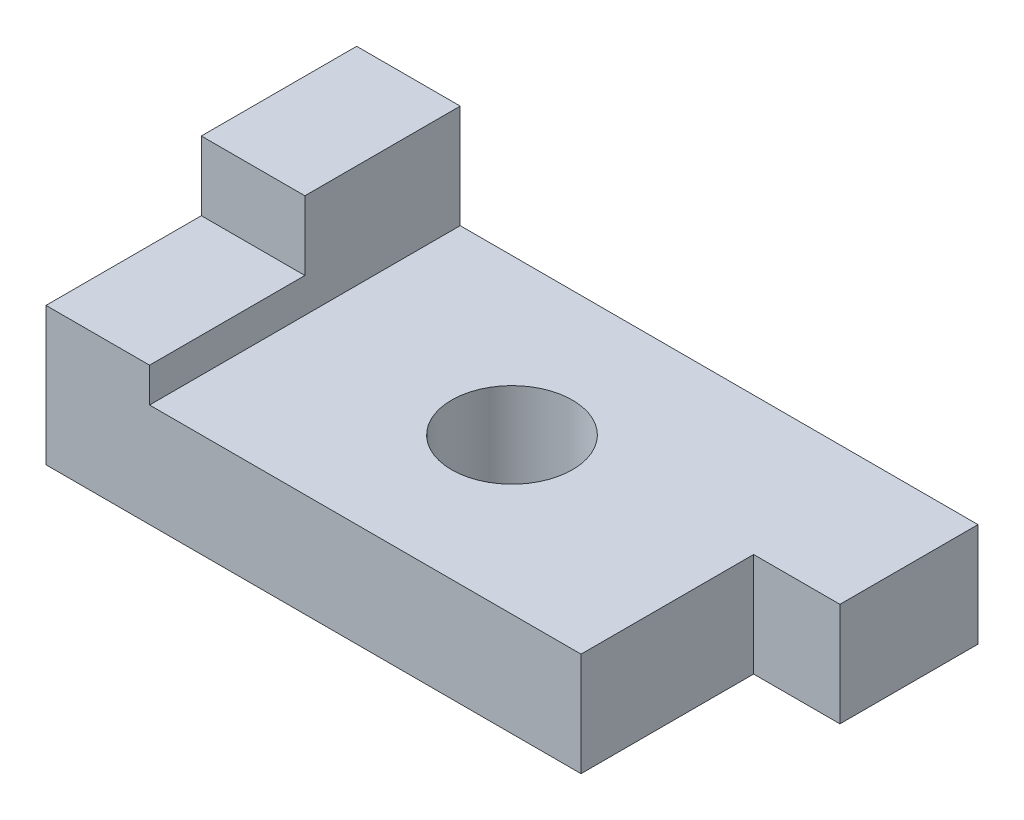
ISO-10303-21;
HEADER;
FILE_DESCRIPTION(('STEP AP214'),'2;1');
FILE_NAME('part.step','',(''),(''),'','','');
FILE_SCHEMA(('AUTOMOTIVE_DESIGN { 1 0 10303 214 1 1 1 1 }'));
ENDSEC;
DATA;
#1=APPLICATION_CONTEXT('core data for automotive mechanical design processes');
#2=APPLICATION_PROTOCOL_DEFINITION('international standard','automotive_design',2000,#1);
#3=PRODUCT_CONTEXT('',#1,'mechanical');
#4=PRODUCT('Part','Part','',(#3));
#5=PRODUCT_RELATED_PRODUCT_CATEGORY('part','',(#4));
#6=PRODUCT_DEFINITION_FORMATION('','',#4);
#7=PRODUCT_DEFINITION_CONTEXT('part definition',#1,'design');
#8=PRODUCT_DEFINITION('design','',#6,#7);
#9=PRODUCT_DEFINITION_SHAPE('','',#8);
#10=(LENGTH_UNIT() NAMED_UNIT(*) SI_UNIT(.MILLI.,.METRE.));
#11=(NAMED_UNIT(*) PLANE_ANGLE_UNIT() SI_UNIT($,.RADIAN.));
#12=(NAMED_UNIT(*) SI_UNIT($,.STERADIAN.) SOLID_ANGLE_UNIT());
#13=UNCERTAINTY_MEASURE_WITH_UNIT(LENGTH_MEASURE(1.E-05),#10,'distance_accuracy_value','');
#14=(GEOMETRIC_REPRESENTATION_CONTEXT(3) GLOBAL_UNCERTAINTY_ASSIGNED_CONTEXT((#13)) GLOBAL_UNIT_ASSIGNED_CONTEXT((#10,
#11,#12)) REPRESENTATION_CONTEXT('',''));
#15=CARTESIAN_POINT('',(0.,0.,0.));
#16=DIRECTION('',(0.,0.,1.));
#17=DIRECTION('',(1.,0.,0.));
#18=AXIS2_PLACEMENT_3D('',#15,#16,#17);
#19=CARTESIAN_POINT('',(0.,12.,0.));
#20=DIRECTION('',(0.,1.,0.));
#21=DIRECTION('',(0.,0.,1.));
#22=AXIS2_PLACEMENT_3D('',#19,#20,#21);
#23=PLANE('',#22);
#24=CARTESIAN_POINT('',(36.,12.,-18.));
#25=DIRECTION('',(0.,1.,0.));
#26=DIRECTION('',(0.,0.,1.));
#27=AXIS2_PLACEMENT_3D('',#24,#25,#26);
#28=CIRCLE('',#27,7.00000000000001);
#29=CARTESIAN_POINT('',(36.,12.,-11.));
#30=VERTEX_POINT('',#29);
#31=EDGE_CURVE('E162',#30,#30,#28,.T.);
#32=ORIENTED_EDGE('',*,*,#31,.F.);
#33=EDGE_LOOP('',(#32));
#34=FACE_BOUND('',#33,.T.);
#35=DIRECTION('',(-1.,0.,0.));
#36=VECTOR('',#35,1.);
#37=CARTESIAN_POINT('',(72.,12.,-36.));
#38=LINE('',#37,#36);
#39=CARTESIAN_POINT('',(72.,12.,-36.));
#40=VERTEX_POINT('',#39);
#41=CARTESIAN_POINT('',(12.,12.,-36.));
#42=VERTEX_POINT('',#41);
#43=EDGE_CURVE('E126',#40,#42,#38,.T.);
#44=ORIENTED_EDGE('',*,*,#43,.T.);
#45=DIRECTION('',(0.,0.,-1.));
#46=VECTOR('',#45,1.);
#47=CARTESIAN_POINT('',(12.,12.,0.));
#48=LINE('',#47,#46);
#49=CARTESIAN_POINT('',(12.,12.,0.));
#50=VERTEX_POINT('',#49);
#51=EDGE_CURVE('E50',#50,#42,#48,.T.);
#52=ORIENTED_EDGE('',*,*,#51,.F.);
#53=DIRECTION('',(1.,0.,0.));
#54=VECTOR('',#53,1.);
#55=CARTESIAN_POINT('',(0.,12.,0.));
#56=LINE('',#55,#54);
#57=CARTESIAN_POINT('',(62.,12.,0.));
#58=VERTEX_POINT('',#57);
#59=EDGE_CURVE('E89',#50,#58,#56,.T.);
#60=ORIENTED_EDGE('',*,*,#59,.T.);
#61=DIRECTION('',(0.,0.,-1.));
#62=VECTOR('',#61,1.);
#63=CARTESIAN_POINT('',(62.,12.,0.));
#64=LINE('',#63,#62);
#65=CARTESIAN_POINT('',(62.,12.,-20.));
#66=VERTEX_POINT('',#65);
#67=EDGE_CURVE('E171',#58,#66,#64,.T.);
#68=ORIENTED_EDGE('',*,*,#67,.T.);
#69=DIRECTION('',(1.,0.,0.));
#70=VECTOR('',#69,1.);
#71=CARTESIAN_POINT('',(62.,12.,-20.));
#72=LINE('',#71,#70);
#73=CARTESIAN_POINT('',(72.,12.,-20.));
#74=VERTEX_POINT('',#73);
#75=EDGE_CURVE('E196',#66,#74,#72,.T.);
#76=ORIENTED_EDGE('',*,*,#75,.T.);
#77=DIRECTION('',(0.,0.,-1.));
#78=VECTOR('',#77,1.);
#79=CARTESIAN_POINT('',(72.,12.,-20.));
#80=LINE('',#79,#78);
#81=EDGE_CURVE('E57',#74,#40,#80,.T.);
#82=ORIENTED_EDGE('',*,*,#81,.T.);
#83=EDGE_LOOP('',(#44,#52,#60,#68,#76,#82));
#84=FACE_BOUND('',#83,.T.);
#85=ADVANCED_FACE('F33',(#34,#84),#23,.T.);
#86=CARTESIAN_POINT('',(0.,0.,0.));
#87=DIRECTION('',(0.,1.,0.));
#88=DIRECTION('',(0.,0.,1.));
#89=AXIS2_PLACEMENT_3D('',#86,#87,#88);
#90=PLANE('',#89);
#91=DIRECTION('',(0.,0.,1.));
#92=VECTOR('',#91,1.);
#93=CARTESIAN_POINT('',(0.,0.,-36.));
#94=LINE('',#93,#92);
#95=CARTESIAN_POINT('',(0.,0.,-36.));
#96=VERTEX_POINT('',#95);
#97=CARTESIAN_POINT('',(0.,0.,0.));
#98=VERTEX_POINT('',#97);
#99=EDGE_CURVE('E165',#96,#98,#94,.T.);
#100=ORIENTED_EDGE('',*,*,#99,.F.);
#101=DIRECTION('',(-1.,0.,0.));
#102=VECTOR('',#101,1.);
#103=CARTESIAN_POINT('',(72.,0.,-36.));
#104=LINE('',#103,#102);
#105=CARTESIAN_POINT('',(72.,0.,-36.));
#106=VERTEX_POINT('',#105);
#107=EDGE_CURVE('E85',#106,#96,#104,.T.);
#108=ORIENTED_EDGE('',*,*,#107,.F.);
#109=DIRECTION('',(0.,0.,-1.));
#110=VECTOR('',#109,1.);
#111=CARTESIAN_POINT('',(72.,0.,-20.));
#112=LINE('',#111,#110);
#113=CARTESIAN_POINT('',(72.,0.,-20.));
#114=VERTEX_POINT('',#113);
#115=EDGE_CURVE('E207',#114,#106,#112,.T.);
#116=ORIENTED_EDGE('',*,*,#115,.F.);
#117=DIRECTION('',(1.,0.,0.));
#118=VECTOR('',#117,1.);
#119=CARTESIAN_POINT('',(62.,0.,-20.));
#120=LINE('',#119,#118);
#121=CARTESIAN_POINT('',(62.,0.,-20.));
#122=VERTEX_POINT('',#121);
#123=EDGE_CURVE('E205',#122,#114,#120,.T.);
#124=ORIENTED_EDGE('',*,*,#123,.F.);
#125=DIRECTION('',(0.,0.,-1.));
#126=VECTOR('',#125,1.);
#127=CARTESIAN_POINT('',(62.,0.,0.));
#128=LINE('',#127,#126);
#129=CARTESIAN_POINT('',(62.,0.,0.));
#130=VERTEX_POINT('',#129);
#131=EDGE_CURVE('E203',#130,#122,#128,.T.);
#132=ORIENTED_EDGE('',*,*,#131,.F.);
#133=DIRECTION('',(1.,0.,0.));
#134=VECTOR('',#133,1.);
#135=CARTESIAN_POINT('',(0.,0.,0.));
#136=LINE('',#135,#134);
#137=EDGE_CURVE('E188',#98,#130,#136,.T.);
#138=ORIENTED_EDGE('',*,*,#137,.F.);
#139=EDGE_LOOP('',(#100,#108,#116,#124,#132,#138));
#140=FACE_BOUND('',#139,.T.);
#141=CARTESIAN_POINT('',(36.,0.,-18.));
#142=DIRECTION('',(0.,1.,0.));
#143=DIRECTION('',(0.,0.,1.));
#144=AXIS2_PLACEMENT_3D('',#141,#142,#143);
#145=CIRCLE('',#144,7.00000000000001);
#146=CARTESIAN_POINT('',(36.,0.,-11.));
#147=VERTEX_POINT('',#146);
#148=EDGE_CURVE('E166',#147,#147,#145,.T.);
#149=ORIENTED_EDGE('',*,*,#148,.T.);
#150=EDGE_LOOP('',(#149));
#151=FACE_BOUND('',#150,.T.);
#152=ADVANCED_FACE('F219',(#140,#151),#90,.F.);
#153=CARTESIAN_POINT('',(0.,12.,-36.));
#154=DIRECTION('',(1.,0.,0.));
#155=DIRECTION('',(0.,0.,-1.));
#156=AXIS2_PLACEMENT_3D('',#153,#154,#155);
#157=PLANE('',#156);
#158=ORIENTED_EDGE('',*,*,#99,.T.);
#159=DIRECTION('',(0.,-1.,0.));
#160=VECTOR('',#159,1.);
#161=CARTESIAN_POINT('',(0.,12.,0.));
#162=LINE('',#161,#160);
#163=CARTESIAN_POINT('',(0.,16.,0.));
#164=VERTEX_POINT('',#163);
#165=EDGE_CURVE('E11',#164,#98,#162,.T.);
#166=ORIENTED_EDGE('',*,*,#165,.F.);
#167=DIRECTION('',(0.,0.,1.));
#168=VECTOR('',#167,1.);
#169=CARTESIAN_POINT('',(0.,16.,-18.));
#170=LINE('',#169,#168);
#171=CARTESIAN_POINT('',(0.,16.,-18.));
#172=VERTEX_POINT('',#171);
#173=EDGE_CURVE('E150',#172,#164,#170,.T.);
#174=ORIENTED_EDGE('',*,*,#173,.F.);
#175=DIRECTION('',(0.,-1.,0.));
#176=VECTOR('',#175,1.);
#177=CARTESIAN_POINT('',(0.,24.,-18.));
#178=LINE('',#177,#176);
#179=CARTESIAN_POINT('',(0.,24.,-18.));
#180=VERTEX_POINT('',#179);
#181=EDGE_CURVE('E131',#180,#172,#178,.T.);
#182=ORIENTED_EDGE('',*,*,#181,.F.);
#183=DIRECTION('',(0.,0.,1.));
#184=VECTOR('',#183,1.);
#185=CARTESIAN_POINT('',(0.,24.,-36.));
#186=LINE('',#185,#184);
#187=CARTESIAN_POINT('',(0.,24.,-36.));
#188=VERTEX_POINT('',#187);
#189=EDGE_CURVE('E129',#188,#180,#186,.T.);
#190=ORIENTED_EDGE('',*,*,#189,.F.);
#191=DIRECTION('',(0.,-1.,0.));
#192=VECTOR('',#191,1.);
#193=CARTESIAN_POINT('',(0.,12.,-36.));
#194=LINE('',#193,#192);
#195=EDGE_CURVE('E116',#188,#96,#194,.T.);
#196=ORIENTED_EDGE('',*,*,#195,.T.);
#197=EDGE_LOOP('',(#158,#166,#174,#182,#190,#196));
#198=FACE_BOUND('',#197,.T.);
#199=ADVANCED_FACE('F35',(#198),#157,.F.);
#200=CARTESIAN_POINT('',(0.,12.,0.));
#201=DIRECTION('',(0.,0.,-1.));
#202=DIRECTION('',(-1.,0.,0.));
#203=AXIS2_PLACEMENT_3D('',#200,#201,#202);
#204=PLANE('',#203);
#205=ORIENTED_EDGE('',*,*,#137,.T.);
#206=DIRECTION('',(0.,-1.,0.));
#207=VECTOR('',#206,1.);
#208=CARTESIAN_POINT('',(62.,12.,0.));
#209=LINE('',#208,#207);
#210=EDGE_CURVE('E42',#58,#130,#209,.T.);
#211=ORIENTED_EDGE('',*,*,#210,.F.);
#212=ORIENTED_EDGE('',*,*,#59,.F.);
#213=DIRECTION('',(0.,-1.,0.));
#214=VECTOR('',#213,1.);
#215=CARTESIAN_POINT('',(12.,16.,0.));
#216=LINE('',#215,#214);
#217=CARTESIAN_POINT('',(12.,16.,0.));
#218=VERTEX_POINT('',#217);
#219=EDGE_CURVE('E161',#218,#50,#216,.T.);
#220=ORIENTED_EDGE('',*,*,#219,.F.);
#221=DIRECTION('',(1.,0.,0.));
#222=VECTOR('',#221,1.);
#223=CARTESIAN_POINT('',(0.,16.,0.));
#224=LINE('',#223,#222);
#225=EDGE_CURVE('E153',#164,#218,#224,.T.);
#226=ORIENTED_EDGE('',*,*,#225,.F.);
#227=ORIENTED_EDGE('',*,*,#165,.T.);
#228=EDGE_LOOP('',(#205,#211,#212,#220,#226,#227));
#229=FACE_BOUND('',#228,.T.);
#230=ADVANCED_FACE('F185',(#229),#204,.F.);
#231=CARTESIAN_POINT('',(62.,12.,0.));
#232=DIRECTION('',(-1.,0.,0.));
#233=DIRECTION('',(0.,0.,1.));
#234=AXIS2_PLACEMENT_3D('',#231,#232,#233);
#235=PLANE('',#234);
#236=ORIENTED_EDGE('',*,*,#131,.T.);
#237=DIRECTION('',(0.,-1.,0.));
#238=VECTOR('',#237,1.);
#239=CARTESIAN_POINT('',(62.,12.,-20.));
#240=LINE('',#239,#238);
#241=EDGE_CURVE('E191',#66,#122,#240,.T.);
#242=ORIENTED_EDGE('',*,*,#241,.F.);
#243=ORIENTED_EDGE('',*,*,#67,.F.);
#244=ORIENTED_EDGE('',*,*,#210,.T.);
#245=EDGE_LOOP('',(#236,#242,#243,#244));
#246=FACE_BOUND('',#245,.T.);
#247=ADVANCED_FACE('F193',(#246),#235,.F.);
#248=CARTESIAN_POINT('',(62.,12.,-20.));
#249=DIRECTION('',(0.,0.,-1.));
#250=DIRECTION('',(-1.,0.,0.));
#251=AXIS2_PLACEMENT_3D('',#248,#249,#250);
#252=PLANE('',#251);
#253=ORIENTED_EDGE('',*,*,#123,.T.);
#254=DIRECTION('',(0.,-1.,0.));
#255=VECTOR('',#254,1.);
#256=CARTESIAN_POINT('',(72.,12.,-20.));
#257=LINE('',#256,#255);
#258=EDGE_CURVE('E211',#74,#114,#257,.T.);
#259=ORIENTED_EDGE('',*,*,#258,.F.);
#260=ORIENTED_EDGE('',*,*,#75,.F.);
#261=ORIENTED_EDGE('',*,*,#241,.T.);
#262=EDGE_LOOP('',(#253,#259,#260,#261));
#263=FACE_BOUND('',#262,.T.);
#264=ADVANCED_FACE('F216',(#263),#252,.F.);
#265=CARTESIAN_POINT('',(72.,12.,-20.));
#266=DIRECTION('',(-1.,0.,0.));
#267=DIRECTION('',(0.,0.,1.));
#268=AXIS2_PLACEMENT_3D('',#265,#266,#267);
#269=PLANE('',#268);
#270=ORIENTED_EDGE('',*,*,#115,.T.);
#271=DIRECTION('',(0.,-1.,0.));
#272=VECTOR('',#271,1.);
#273=CARTESIAN_POINT('',(72.,12.,-36.));
#274=LINE('',#273,#272);
#275=EDGE_CURVE('E125',#40,#106,#274,.T.);
#276=ORIENTED_EDGE('',*,*,#275,.F.);
#277=ORIENTED_EDGE('',*,*,#81,.F.);
#278=ORIENTED_EDGE('',*,*,#258,.T.);
#279=EDGE_LOOP('',(#270,#276,#277,#278));
#280=FACE_BOUND('',#279,.T.);
#281=ADVANCED_FACE('F222',(#280),#269,.F.);
#282=CARTESIAN_POINT('',(72.,12.,-36.));
#283=DIRECTION('',(0.,0.,1.));
#284=DIRECTION('',(1.,0.,0.));
#285=AXIS2_PLACEMENT_3D('',#282,#283,#284);
#286=PLANE('',#285);
#287=ORIENTED_EDGE('',*,*,#107,.T.);
#288=ORIENTED_EDGE('',*,*,#195,.F.);
#289=DIRECTION('',(-1.,0.,0.));
#290=VECTOR('',#289,1.);
#291=CARTESIAN_POINT('',(12.,24.,-36.));
#292=LINE('',#291,#290);
#293=CARTESIAN_POINT('',(12.,24.,-36.));
#294=VERTEX_POINT('',#293);
#295=EDGE_CURVE('E121',#294,#188,#292,.T.);
#296=ORIENTED_EDGE('',*,*,#295,.F.);
#297=DIRECTION('',(0.,-1.,0.));
#298=VECTOR('',#297,1.);
#299=CARTESIAN_POINT('',(12.,24.,-36.));
#300=LINE('',#299,#298);
#301=EDGE_CURVE('E144',#294,#42,#300,.T.);
#302=ORIENTED_EDGE('',*,*,#301,.T.);
#303=ORIENTED_EDGE('',*,*,#43,.F.);
#304=ORIENTED_EDGE('',*,*,#275,.T.);
#305=EDGE_LOOP('',(#287,#288,#296,#302,#303,#304));
#306=FACE_BOUND('',#305,.T.);
#307=ADVANCED_FACE('F118',(#306),#286,.F.);
#308=CARTESIAN_POINT('',(36.,12.,-18.));
#309=DIRECTION('',(0.,-1.,0.));
#310=DIRECTION('',(0.,0.,-1.));
#311=AXIS2_PLACEMENT_3D('',#308,#309,#310);
#312=CYLINDRICAL_SURFACE('',#311,7.00000000000001);
#313=ORIENTED_EDGE('',*,*,#31,.T.);
#314=EDGE_LOOP('',(#313));
#315=FACE_BOUND('',#314,.T.);
#316=ORIENTED_EDGE('',*,*,#148,.F.);
#317=EDGE_LOOP('',(#316));
#318=FACE_BOUND('',#317,.T.);
#319=ADVANCED_FACE('F233',(#315,#318),#312,.F.);
#320=CARTESIAN_POINT('',(12.,16.,0.));
#321=DIRECTION('',(-1.,0.,0.));
#322=DIRECTION('',(0.,0.,1.));
#323=AXIS2_PLACEMENT_3D('',#320,#321,#322);
#324=PLANE('',#323);
#325=ORIENTED_EDGE('',*,*,#51,.T.);
#326=ORIENTED_EDGE('',*,*,#301,.F.);
#327=DIRECTION('',(0.,0.,-1.));
#328=VECTOR('',#327,1.);
#329=CARTESIAN_POINT('',(12.,24.,-18.));
#330=LINE('',#329,#328);
#331=CARTESIAN_POINT('',(12.,24.,-18.));
#332=VERTEX_POINT('',#331);
#333=EDGE_CURVE('E138',#332,#294,#330,.T.);
#334=ORIENTED_EDGE('',*,*,#333,.F.);
#335=DIRECTION('',(0.,-1.,0.));
#336=VECTOR('',#335,1.);
#337=CARTESIAN_POINT('',(12.,24.,-18.));
#338=LINE('',#337,#336);
#339=CARTESIAN_POINT('',(12.,16.,-18.));
#340=VERTEX_POINT('',#339);
#341=EDGE_CURVE('E146',#332,#340,#338,.T.);
#342=ORIENTED_EDGE('',*,*,#341,.T.);
#343=DIRECTION('',(0.,0.,-1.));
#344=VECTOR('',#343,1.);
#345=CARTESIAN_POINT('',(12.,16.,0.));
#346=LINE('',#345,#344);
#347=EDGE_CURVE('E155',#218,#340,#346,.T.);
#348=ORIENTED_EDGE('',*,*,#347,.F.);
#349=ORIENTED_EDGE('',*,*,#219,.T.);
#350=EDGE_LOOP('',(#325,#326,#334,#342,#348,#349));
#351=FACE_BOUND('',#350,.T.);
#352=ADVANCED_FACE('F182',(#351),#324,.F.);
#353=CARTESIAN_POINT('',(0.,16.,0.));
#354=DIRECTION('',(0.,1.,0.));
#355=DIRECTION('',(0.,0.,1.));
#356=AXIS2_PLACEMENT_3D('',#353,#354,#355);
#357=PLANE('',#356);
#358=ORIENTED_EDGE('',*,*,#173,.T.);
#359=ORIENTED_EDGE('',*,*,#225,.T.);
#360=ORIENTED_EDGE('',*,*,#347,.T.);
#361=DIRECTION('',(-1.,0.,0.));
#362=VECTOR('',#361,1.);
#363=CARTESIAN_POINT('',(12.,16.,-18.));
#364=LINE('',#363,#362);
#365=EDGE_CURVE('E158',#340,#172,#364,.T.);
#366=ORIENTED_EDGE('',*,*,#365,.T.);
#367=EDGE_LOOP('',(#358,#359,#360,#366));
#368=FACE_BOUND('',#367,.T.);
#369=ADVANCED_FACE('F299',(#368),#357,.T.);
#370=CARTESIAN_POINT('',(0.,24.,-18.));
#371=DIRECTION('',(0.,0.,-1.));
#372=DIRECTION('',(-1.,0.,0.));
#373=AXIS2_PLACEMENT_3D('',#370,#371,#372);
#374=PLANE('',#373);
#375=ORIENTED_EDGE('',*,*,#365,.F.);
#376=ORIENTED_EDGE('',*,*,#341,.F.);
#377=DIRECTION('',(1.,0.,0.));
#378=VECTOR('',#377,1.);
#379=CARTESIAN_POINT('',(0.,24.,-18.));
#380=LINE('',#379,#378);
#381=EDGE_CURVE('E134',#180,#332,#380,.T.);
#382=ORIENTED_EDGE('',*,*,#381,.F.);
#383=ORIENTED_EDGE('',*,*,#181,.T.);
#384=EDGE_LOOP('',(#375,#376,#382,#383));
#385=FACE_BOUND('',#384,.T.);
#386=ADVANCED_FACE('F321',(#385),#374,.F.);
#387=CARTESIAN_POINT('',(0.,24.,0.));
#388=DIRECTION('',(0.,1.,0.));
#389=DIRECTION('',(0.,0.,1.));
#390=AXIS2_PLACEMENT_3D('',#387,#388,#389);
#391=PLANE('',#390);
#392=ORIENTED_EDGE('',*,*,#295,.T.);
#393=ORIENTED_EDGE('',*,*,#189,.T.);
#394=ORIENTED_EDGE('',*,*,#381,.T.);
#395=ORIENTED_EDGE('',*,*,#333,.T.);
#396=EDGE_LOOP('',(#392,#393,#394,#395));
#397=FACE_BOUND('',#396,.T.);
#398=ADVANCED_FACE('F136',(#397),#391,.T.);
#399=CLOSED_SHELL('',(#85,#152,#199,#230,#247,#264,#281,#307,#319,#352,#369,#386,#398));
#400=MANIFOLD_SOLID_BREP('B2',#399);
#401=ADVANCED_BREP_SHAPE_REPRESENTATION('',(#18,#400),#14);
#402=SHAPE_DEFINITION_REPRESENTATION(#9,#401);
ENDSEC;
END-ISO-10303-21;
